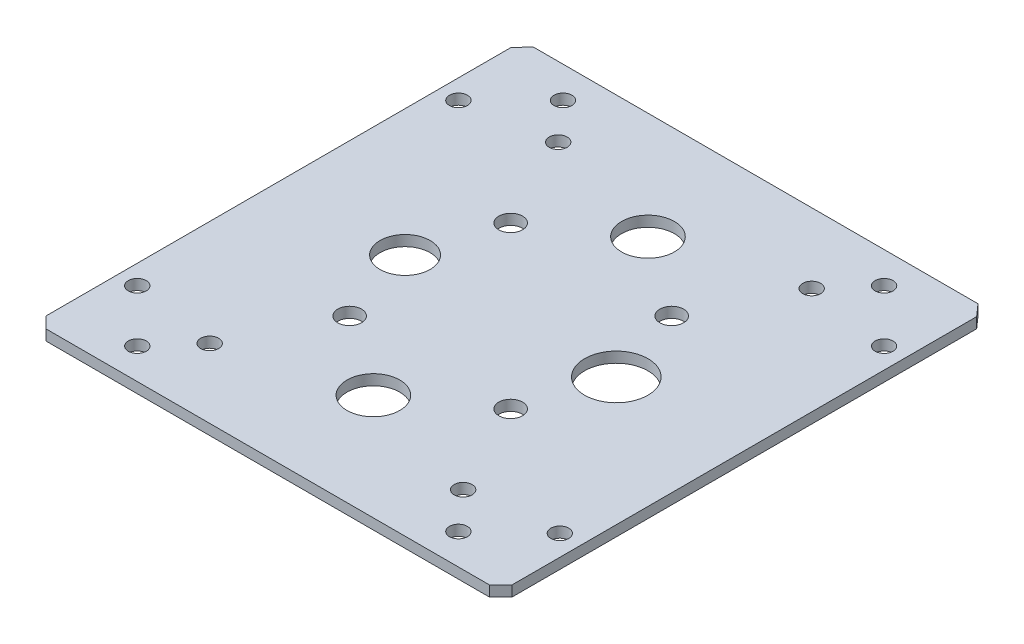
ISO-10303-21;
HEADER;
FILE_DESCRIPTION(('STEP AP214'),'2;1');
FILE_NAME('part.step','',(''),(''),'','','');
FILE_SCHEMA(('AUTOMOTIVE_DESIGN { 1 0 10303 214 1 1 1 1 }'));
ENDSEC;
DATA;
#1=APPLICATION_CONTEXT('core data for automotive mechanical design processes');
#2=APPLICATION_PROTOCOL_DEFINITION('international standard','automotive_design',2000,#1);
#3=PRODUCT_CONTEXT('',#1,'mechanical');
#4=PRODUCT('Part','Part','',(#3));
#5=PRODUCT_RELATED_PRODUCT_CATEGORY('part','',(#4));
#6=PRODUCT_DEFINITION_FORMATION('','',#4);
#7=PRODUCT_DEFINITION_CONTEXT('part definition',#1,'design');
#8=PRODUCT_DEFINITION('design','',#6,#7);
#9=PRODUCT_DEFINITION_SHAPE('','',#8);
#10=(LENGTH_UNIT() NAMED_UNIT(*) SI_UNIT(.MILLI.,.METRE.));
#11=(NAMED_UNIT(*) PLANE_ANGLE_UNIT() SI_UNIT($,.RADIAN.));
#12=(NAMED_UNIT(*) SI_UNIT($,.STERADIAN.) SOLID_ANGLE_UNIT());
#13=UNCERTAINTY_MEASURE_WITH_UNIT(LENGTH_MEASURE(1.E-05),#10,'distance_accuracy_value','');
#14=(GEOMETRIC_REPRESENTATION_CONTEXT(3) GLOBAL_UNCERTAINTY_ASSIGNED_CONTEXT((#13)) GLOBAL_UNIT_ASSIGNED_CONTEXT((#10,
#11,#12)) REPRESENTATION_CONTEXT('',''));
#15=CARTESIAN_POINT('',(0.,0.,0.));
#16=DIRECTION('',(0.,0.,1.));
#17=DIRECTION('',(1.,0.,0.));
#18=AXIS2_PLACEMENT_3D('',#15,#16,#17);
#19=CARTESIAN_POINT('',(0.,2.,0.));
#20=DIRECTION('',(0.,1.,0.));
#21=DIRECTION('',(0.,0.,1.));
#22=AXIS2_PLACEMENT_3D('',#19,#20,#21);
#23=PLANE('',#22);
#24=CARTESIAN_POINT('',(30.40559154,2.,-40.30508646));
#25=DIRECTION('',(0.,1.,0.));
#26=DIRECTION('',(0.,0.,1.));
#27=AXIS2_PLACEMENT_3D('',#24,#25,#26);
#28=CIRCLE('',#27,1.7);
#29=CARTESIAN_POINT('',(30.40559154,2.,-38.60508646));
#30=VERTEX_POINT('',#29);
#31=EDGE_CURVE('E354',#30,#30,#28,.T.);
#32=ORIENTED_EDGE('',*,*,#31,.F.);
#33=EDGE_LOOP('',(#32));
#34=FACE_BOUND('',#33,.T.);
#35=CARTESIAN_POINT('',(40.30508646,2.,31.));
#36=DIRECTION('',(0.,1.,0.));
#37=DIRECTION('',(0.,0.,1.));
#38=AXIS2_PLACEMENT_3D('',#35,#36,#37);
#39=CIRCLE('',#38,1.69491354);
#40=CARTESIAN_POINT('',(40.30508646,2.,32.69491354));
#41=VERTEX_POINT('',#40);
#42=EDGE_CURVE('E338',#41,#41,#39,.T.);
#43=ORIENTED_EDGE('',*,*,#42,.F.);
#44=EDGE_LOOP('',(#43));
#45=FACE_BOUND('',#44,.T.);
#46=CARTESIAN_POINT('',(-40.30508646,2.,-30.40559154));
#47=DIRECTION('',(0.,1.,0.));
#48=DIRECTION('',(0.,0.,1.));
#49=AXIS2_PLACEMENT_3D('',#46,#47,#48);
#50=CIRCLE('',#49,1.7);
#51=CARTESIAN_POINT('',(-40.30508646,2.,-28.70559154));
#52=VERTEX_POINT('',#51);
#53=EDGE_CURVE('E322',#52,#52,#50,.T.);
#54=ORIENTED_EDGE('',*,*,#53,.F.);
#55=EDGE_LOOP('',(#54));
#56=FACE_BOUND('',#55,.T.);
#57=CARTESIAN_POINT('',(-30.40559154,2.,40.30508646));
#58=DIRECTION('',(0.,1.,0.));
#59=DIRECTION('',(0.,0.,1.));
#60=AXIS2_PLACEMENT_3D('',#57,#58,#59);
#61=CIRCLE('',#60,1.7);
#62=CARTESIAN_POINT('',(-30.40559154,2.,42.00508646));
#63=VERTEX_POINT('',#62);
#64=EDGE_CURVE('E306',#63,#63,#61,.T.);
#65=ORIENTED_EDGE('',*,*,#64,.F.);
#66=EDGE_LOOP('',(#65));
#67=FACE_BOUND('',#66,.T.);
#68=CARTESIAN_POINT('',(0.,2.,-26.));
#69=DIRECTION('',(0.,1.,0.));
#70=DIRECTION('',(0.,0.,1.));
#71=AXIS2_PLACEMENT_3D('',#68,#69,#70);
#72=CIRCLE('',#71,5.);
#73=CARTESIAN_POINT('',(0.,2.,-21.));
#74=VERTEX_POINT('',#73);
#75=EDGE_CURVE('E290',#74,#74,#72,.T.);
#76=ORIENTED_EDGE('',*,*,#75,.F.);
#77=EDGE_LOOP('',(#76));
#78=FACE_BOUND('',#77,.T.);
#79=CARTESIAN_POINT('',(20.,2.,0.));
#80=DIRECTION('',(0.,1.,0.));
#81=DIRECTION('',(0.,0.,1.));
#82=AXIS2_PLACEMENT_3D('',#79,#80,#81);
#83=CIRCLE('',#82,6.);
#84=CARTESIAN_POINT('',(20.,2.,6.));
#85=VERTEX_POINT('',#84);
#86=EDGE_CURVE('E274',#85,#85,#83,.T.);
#87=ORIENTED_EDGE('',*,*,#86,.F.);
#88=EDGE_LOOP('',(#87));
#89=FACE_BOUND('',#88,.T.);
#90=CARTESIAN_POINT('',(24.,2.,-33.));
#91=DIRECTION('',(0.,1.,0.));
#92=DIRECTION('',(0.,0.,1.));
#93=AXIS2_PLACEMENT_3D('',#90,#91,#92);
#94=CIRCLE('',#93,1.7);
#95=CARTESIAN_POINT('',(24.,2.,-31.3));
#96=VERTEX_POINT('',#95);
#97=EDGE_CURVE('E258',#96,#96,#94,.T.);
#98=ORIENTED_EDGE('',*,*,#97,.F.);
#99=EDGE_LOOP('',(#98));
#100=FACE_BOUND('',#99,.T.);
#101=CARTESIAN_POINT('',(-24.,2.,33.));
#102=DIRECTION('',(0.,1.,0.));
#103=DIRECTION('',(0.,0.,1.));
#104=AXIS2_PLACEMENT_3D('',#101,#102,#103);
#105=CIRCLE('',#104,1.7);
#106=CARTESIAN_POINT('',(-24.,2.,34.7));
#107=VERTEX_POINT('',#106);
#108=EDGE_CURVE('E242',#107,#107,#105,.T.);
#109=ORIENTED_EDGE('',*,*,#108,.F.);
#110=EDGE_LOOP('',(#109));
#111=FACE_BOUND('',#110,.T.);
#112=CARTESIAN_POINT('',(15.25,2.,15.2500000000002));
#113=DIRECTION('',(0.,1.,0.));
#114=DIRECTION('',(0.,0.,1.));
#115=AXIS2_PLACEMENT_3D('',#112,#113,#114);
#116=CIRCLE('',#115,2.25);
#117=CARTESIAN_POINT('',(15.25,2.,17.5000000000002));
#118=VERTEX_POINT('',#117);
#119=EDGE_CURVE('E226',#118,#118,#116,.T.);
#120=ORIENTED_EDGE('',*,*,#119,.F.);
#121=EDGE_LOOP('',(#120));
#122=FACE_BOUND('',#121,.T.);
#123=CARTESIAN_POINT('',(-15.2499999999998,2.,15.2500000000002));
#124=DIRECTION('',(0.,1.,0.));
#125=DIRECTION('',(0.,0.,1.));
#126=AXIS2_PLACEMENT_3D('',#123,#124,#125);
#127=CIRCLE('',#126,2.25);
#128=CARTESIAN_POINT('',(-15.2499999999998,2.,17.5000000000002));
#129=VERTEX_POINT('',#128);
#130=EDGE_CURVE('E151',#129,#129,#127,.T.);
#131=ORIENTED_EDGE('',*,*,#130,.F.);
#132=EDGE_LOOP('',(#131));
#133=FACE_BOUND('',#132,.T.);
#134=DIRECTION('',(0.707106781186544,0.,0.707106781186551));
#135=VECTOR('',#134,1.);
#136=CARTESIAN_POINT('',(-44.,2.,44.));
#137=LINE('',#136,#135);
#138=CARTESIAN_POINT('',(-44.,2.,44.));
#139=VERTEX_POINT('',#138);
#140=CARTESIAN_POINT('',(-41.8786796564403,2.,46.1213203435597));
#141=VERTEX_POINT('',#140);
#142=EDGE_CURVE('E169',#139,#141,#137,.T.);
#143=ORIENTED_EDGE('',*,*,#142,.T.);
#144=DIRECTION('',(1.,0.,0.));
#145=VECTOR('',#144,1.);
#146=CARTESIAN_POINT('',(-41.8786796564403,2.,46.1213203435597));
#147=LINE('',#146,#145);
#148=CARTESIAN_POINT('',(42.1213203435597,2.,46.1213203435597));
#149=VERTEX_POINT('',#148);
#150=EDGE_CURVE('E105',#141,#149,#147,.T.);
#151=ORIENTED_EDGE('',*,*,#150,.T.);
#152=DIRECTION('',(0.705724441998419,0.,-0.708486423275718));
#153=VECTOR('',#152,1.);
#154=CARTESIAN_POINT('',(42.1213203435597,2.,46.1213203435597));
#155=LINE('',#154,#153);
#156=CARTESIAN_POINT('',(44.2384936695549,2.,43.9958610737325));
#157=VERTEX_POINT('',#156);
#158=EDGE_CURVE('E190',#149,#157,#155,.T.);
#159=ORIENTED_EDGE('',*,*,#158,.T.);
#160=DIRECTION('',(0.,0.,-1.));
#161=VECTOR('',#160,1.);
#162=CARTESIAN_POINT('',(44.2384936695549,2.,43.9958610737325));
#163=LINE('',#162,#161);
#164=CARTESIAN_POINT('',(44.2384936695549,2.,-44.0041389262675));
#165=VERTEX_POINT('',#164);
#166=EDGE_CURVE('E204',#157,#165,#163,.T.);
#167=ORIENTED_EDGE('',*,*,#166,.T.);
#168=DIRECTION('',(-0.662994885720955,0.,-0.748623925284156));
#169=VECTOR('',#168,1.);
#170=CARTESIAN_POINT('',(44.2384936695549,2.,-44.0041389262675));
#171=LINE('',#170,#169);
#172=CARTESIAN_POINT('',(42.2495090123921,2.,-46.25001070212));
#173=VERTEX_POINT('',#172);
#174=EDGE_CURVE('E124',#165,#173,#171,.T.);
#175=ORIENTED_EDGE('',*,*,#174,.T.);
#176=DIRECTION('',(-1.,0.,0.));
#177=VECTOR('',#176,1.);
#178=CARTESIAN_POINT('',(42.2495090123921,2.,-46.25001070212));
#179=LINE('',#178,#177);
#180=CARTESIAN_POINT('',(-42.0156986518309,2.,-46.25001070212));
#181=VERTEX_POINT('',#180);
#182=EDGE_CURVE('E118',#173,#181,#179,.T.);
#183=ORIENTED_EDGE('',*,*,#182,.T.);
#184=DIRECTION('',(-0.661433782723025,0.,0.750003567373323));
#185=VECTOR('',#184,1.);
#186=CARTESIAN_POINT('',(-42.0156986518309,2.,-46.25001070212));
#187=LINE('',#186,#185);
#188=CARTESIAN_POINT('',(-44.,2.,-44.));
#189=VERTEX_POINT('',#188);
#190=EDGE_CURVE('E122',#181,#189,#187,.T.);
#191=ORIENTED_EDGE('',*,*,#190,.T.);
#192=DIRECTION('',(0.,0.,1.));
#193=VECTOR('',#192,1.);
#194=CARTESIAN_POINT('',(-44.,2.,-44.));
#195=LINE('',#194,#193);
#196=EDGE_CURVE('E62',#189,#139,#195,.T.);
#197=ORIENTED_EDGE('',*,*,#196,.T.);
#198=EDGE_LOOP('',(#143,#151,#159,#167,#175,#183,#191,#197));
#199=FACE_BOUND('',#198,.T.);
#200=CARTESIAN_POINT('',(-15.2499999999998,2.,-15.25));
#201=DIRECTION('',(0.,1.,0.));
#202=DIRECTION('',(0.,0.,1.));
#203=AXIS2_PLACEMENT_3D('',#200,#201,#202);
#204=CIRCLE('',#203,2.24999999999985);
#205=CARTESIAN_POINT('',(-15.2499999999998,2.,-13.0000000000002));
#206=VERTEX_POINT('',#205);
#207=EDGE_CURVE('E218',#206,#206,#204,.T.);
#208=ORIENTED_EDGE('',*,*,#207,.F.);
#209=EDGE_LOOP('',(#208));
#210=FACE_BOUND('',#209,.T.);
#211=CARTESIAN_POINT('',(15.25,2.,-15.25));
#212=DIRECTION('',(0.,1.,0.));
#213=DIRECTION('',(0.,0.,1.));
#214=AXIS2_PLACEMENT_3D('',#211,#212,#213);
#215=CIRCLE('',#214,2.25);
#216=CARTESIAN_POINT('',(15.25,2.,-13.));
#217=VERTEX_POINT('',#216);
#218=EDGE_CURVE('E234',#217,#217,#215,.T.);
#219=ORIENTED_EDGE('',*,*,#218,.F.);
#220=EDGE_LOOP('',(#219));
#221=FACE_BOUND('',#220,.T.);
#222=CARTESIAN_POINT('',(24.,2.,33.));
#223=DIRECTION('',(0.,1.,0.));
#224=DIRECTION('',(0.,0.,-1.));
#225=AXIS2_PLACEMENT_3D('',#222,#223,#224);
#226=CIRCLE('',#225,1.7);
#227=CARTESIAN_POINT('',(24.,2.,31.3));
#228=VERTEX_POINT('',#227);
#229=EDGE_CURVE('E250',#228,#228,#226,.T.);
#230=ORIENTED_EDGE('',*,*,#229,.F.);
#231=EDGE_LOOP('',(#230));
#232=FACE_BOUND('',#231,.T.);
#233=CARTESIAN_POINT('',(-24.,2.,-33.));
#234=DIRECTION('',(0.,1.,0.));
#235=DIRECTION('',(0.,0.,-1.));
#236=AXIS2_PLACEMENT_3D('',#233,#234,#235);
#237=CIRCLE('',#236,1.7);
#238=CARTESIAN_POINT('',(-24.,2.,-34.7));
#239=VERTEX_POINT('',#238);
#240=EDGE_CURVE('E266',#239,#239,#237,.T.);
#241=ORIENTED_EDGE('',*,*,#240,.F.);
#242=EDGE_LOOP('',(#241));
#243=FACE_BOUND('',#242,.T.);
#244=CARTESIAN_POINT('',(-20.,2.,0.));
#245=DIRECTION('',(0.,1.,0.));
#246=DIRECTION('',(0.,0.,1.));
#247=AXIS2_PLACEMENT_3D('',#244,#245,#246);
#248=CIRCLE('',#247,4.75000000000016);
#249=CARTESIAN_POINT('',(-20.,2.,4.75000000000016));
#250=VERTEX_POINT('',#249);
#251=EDGE_CURVE('E282',#250,#250,#248,.T.);
#252=ORIENTED_EDGE('',*,*,#251,.F.);
#253=EDGE_LOOP('',(#252));
#254=FACE_BOUND('',#253,.T.);
#255=CARTESIAN_POINT('',(0.,2.,26.));
#256=DIRECTION('',(0.,1.,0.));
#257=DIRECTION('',(0.,0.,1.));
#258=AXIS2_PLACEMENT_3D('',#255,#256,#257);
#259=CIRCLE('',#258,5.);
#260=CARTESIAN_POINT('',(0.,2.,31.));
#261=VERTEX_POINT('',#260);
#262=EDGE_CURVE('E298',#261,#261,#259,.T.);
#263=ORIENTED_EDGE('',*,*,#262,.F.);
#264=EDGE_LOOP('',(#263));
#265=FACE_BOUND('',#264,.T.);
#266=CARTESIAN_POINT('',(-30.40559154,2.,-40.30508646));
#267=DIRECTION('',(0.,1.,0.));
#268=DIRECTION('',(0.,0.,1.));
#269=AXIS2_PLACEMENT_3D('',#266,#267,#268);
#270=CIRCLE('',#269,1.7);
#271=CARTESIAN_POINT('',(-30.40559154,2.,-38.60508646));
#272=VERTEX_POINT('',#271);
#273=EDGE_CURVE('E314',#272,#272,#270,.T.);
#274=ORIENTED_EDGE('',*,*,#273,.F.);
#275=EDGE_LOOP('',(#274));
#276=FACE_BOUND('',#275,.T.);
#277=CARTESIAN_POINT('',(30.40559154,2.,40.30508646));
#278=DIRECTION('',(0.,1.,0.));
#279=DIRECTION('',(0.,0.,1.));
#280=AXIS2_PLACEMENT_3D('',#277,#278,#279);
#281=CIRCLE('',#280,1.7);
#282=CARTESIAN_POINT('',(30.40559154,2.,42.00508646));
#283=VERTEX_POINT('',#282);
#284=EDGE_CURVE('E330',#283,#283,#281,.T.);
#285=ORIENTED_EDGE('',*,*,#284,.F.);
#286=EDGE_LOOP('',(#285));
#287=FACE_BOUND('',#286,.T.);
#288=CARTESIAN_POINT('',(40.30508646,2.,-30.40559154));
#289=DIRECTION('',(0.,1.,0.));
#290=DIRECTION('',(0.,0.,1.));
#291=AXIS2_PLACEMENT_3D('',#288,#289,#290);
#292=CIRCLE('',#291,1.69491353999988);
#293=CARTESIAN_POINT('',(40.30508646,2.,-28.7106780000001));
#294=VERTEX_POINT('',#293);
#295=EDGE_CURVE('E346',#294,#294,#292,.T.);
#296=ORIENTED_EDGE('',*,*,#295,.F.);
#297=EDGE_LOOP('',(#296));
#298=FACE_BOUND('',#297,.T.);
#299=CARTESIAN_POINT('',(-40.30508646,2.,30.40559154));
#300=DIRECTION('',(0.,1.,0.));
#301=DIRECTION('',(0.,0.,-1.));
#302=AXIS2_PLACEMENT_3D('',#299,#300,#301);
#303=CIRCLE('',#302,1.7);
#304=CARTESIAN_POINT('',(-40.30508646,2.,28.70559154));
#305=VERTEX_POINT('',#304);
#306=EDGE_CURVE('E362',#305,#305,#303,.T.);
#307=ORIENTED_EDGE('',*,*,#306,.F.);
#308=EDGE_LOOP('',(#307));
#309=FACE_BOUND('',#308,.T.);
#310=ADVANCED_FACE('F44',(#34,#45,#56,#67,#78,#89,#100,#111,#122,#133,#199,#210,#221,#232,#243,
#254,#265,#276,#287,#298,#309),#23,.T.);
#311=CARTESIAN_POINT('',(0.,0.,0.));
#312=DIRECTION('',(0.,1.,0.));
#313=DIRECTION('',(0.,0.,1.));
#314=AXIS2_PLACEMENT_3D('',#311,#312,#313);
#315=PLANE('',#314);
#316=DIRECTION('',(0.707106781186544,0.,0.707106781186551));
#317=VECTOR('',#316,1.);
#318=CARTESIAN_POINT('',(-44.,0.,44.));
#319=LINE('',#318,#317);
#320=CARTESIAN_POINT('',(-44.,0.,44.));
#321=VERTEX_POINT('',#320);
#322=CARTESIAN_POINT('',(-41.8786796564403,0.,46.1213203435597));
#323=VERTEX_POINT('',#322);
#324=EDGE_CURVE('E146',#321,#323,#319,.T.);
#325=ORIENTED_EDGE('',*,*,#324,.F.);
#326=DIRECTION('',(0.,0.,1.));
#327=VECTOR('',#326,1.);
#328=CARTESIAN_POINT('',(-44.,0.,-44.));
#329=LINE('',#328,#327);
#330=CARTESIAN_POINT('',(-44.,0.,-44.));
#331=VERTEX_POINT('',#330);
#332=EDGE_CURVE('E97',#331,#321,#329,.T.);
#333=ORIENTED_EDGE('',*,*,#332,.F.);
#334=DIRECTION('',(-0.661433782723025,0.,0.750003567373323));
#335=VECTOR('',#334,1.);
#336=CARTESIAN_POINT('',(-42.0156986518309,0.,-46.25001070212));
#337=LINE('',#336,#335);
#338=CARTESIAN_POINT('',(-42.0156986518309,0.,-46.25001070212));
#339=VERTEX_POINT('',#338);
#340=EDGE_CURVE('E91',#339,#331,#337,.T.);
#341=ORIENTED_EDGE('',*,*,#340,.F.);
#342=DIRECTION('',(-1.,0.,0.));
#343=VECTOR('',#342,1.);
#344=CARTESIAN_POINT('',(42.2495090123921,0.,-46.25001070212));
#345=LINE('',#344,#343);
#346=CARTESIAN_POINT('',(42.2495090123921,0.,-46.25001070212));
#347=VERTEX_POINT('',#346);
#348=EDGE_CURVE('E133',#347,#339,#345,.T.);
#349=ORIENTED_EDGE('',*,*,#348,.F.);
#350=DIRECTION('',(-0.662994885720955,0.,-0.748623925284156));
#351=VECTOR('',#350,1.);
#352=CARTESIAN_POINT('',(44.2384936695549,0.,-44.0041389262675));
#353=LINE('',#352,#351);
#354=CARTESIAN_POINT('',(44.2384936695549,0.,-44.0041389262675));
#355=VERTEX_POINT('',#354);
#356=EDGE_CURVE('E160',#355,#347,#353,.T.);
#357=ORIENTED_EDGE('',*,*,#356,.F.);
#358=DIRECTION('',(0.,0.,-1.));
#359=VECTOR('',#358,1.);
#360=CARTESIAN_POINT('',(44.2384936695549,0.,43.9958610737325));
#361=LINE('',#360,#359);
#362=CARTESIAN_POINT('',(44.2384936695549,0.,43.9958610737325));
#363=VERTEX_POINT('',#362);
#364=EDGE_CURVE('E157',#363,#355,#361,.T.);
#365=ORIENTED_EDGE('',*,*,#364,.F.);
#366=DIRECTION('',(0.705724441998419,0.,-0.708486423275718));
#367=VECTOR('',#366,1.);
#368=CARTESIAN_POINT('',(42.1213203435597,0.,46.1213203435597));
#369=LINE('',#368,#367);
#370=CARTESIAN_POINT('',(42.1213203435597,0.,46.1213203435597));
#371=VERTEX_POINT('',#370);
#372=EDGE_CURVE('E154',#371,#363,#369,.T.);
#373=ORIENTED_EDGE('',*,*,#372,.F.);
#374=DIRECTION('',(1.,0.,0.));
#375=VECTOR('',#374,1.);
#376=CARTESIAN_POINT('',(-41.8786796564403,0.,46.1213203435597));
#377=LINE('',#376,#375);
#378=EDGE_CURVE('E150',#323,#371,#377,.T.);
#379=ORIENTED_EDGE('',*,*,#378,.F.);
#380=EDGE_LOOP('',(#325,#333,#341,#349,#357,#365,#373,#379));
#381=FACE_BOUND('',#380,.T.);
#382=CARTESIAN_POINT('',(-15.2499999999998,0.,15.2500000000002));
#383=DIRECTION('',(0.,1.,0.));
#384=DIRECTION('',(0.,0.,1.));
#385=AXIS2_PLACEMENT_3D('',#382,#383,#384);
#386=CIRCLE('',#385,2.25);
#387=CARTESIAN_POINT('',(-15.2499999999998,0.,17.5000000000002));
#388=VERTEX_POINT('',#387);
#389=EDGE_CURVE('E214',#388,#388,#386,.T.);
#390=ORIENTED_EDGE('',*,*,#389,.T.);
#391=EDGE_LOOP('',(#390));
#392=FACE_BOUND('',#391,.T.);
#393=CARTESIAN_POINT('',(-15.2499999999998,0.,-15.25));
#394=DIRECTION('',(0.,1.,0.));
#395=DIRECTION('',(0.,0.,1.));
#396=AXIS2_PLACEMENT_3D('',#393,#394,#395);
#397=CIRCLE('',#396,2.24999999999985);
#398=CARTESIAN_POINT('',(-15.2499999999998,0.,-13.0000000000002));
#399=VERTEX_POINT('',#398);
#400=EDGE_CURVE('E222',#399,#399,#397,.T.);
#401=ORIENTED_EDGE('',*,*,#400,.T.);
#402=EDGE_LOOP('',(#401));
#403=FACE_BOUND('',#402,.T.);
#404=CARTESIAN_POINT('',(15.25,0.,15.2500000000002));
#405=DIRECTION('',(0.,1.,0.));
#406=DIRECTION('',(0.,0.,1.));
#407=AXIS2_PLACEMENT_3D('',#404,#405,#406);
#408=CIRCLE('',#407,2.25);
#409=CARTESIAN_POINT('',(15.25,0.,17.5000000000002));
#410=VERTEX_POINT('',#409);
#411=EDGE_CURVE('E230',#410,#410,#408,.T.);
#412=ORIENTED_EDGE('',*,*,#411,.T.);
#413=EDGE_LOOP('',(#412));
#414=FACE_BOUND('',#413,.T.);
#415=CARTESIAN_POINT('',(15.25,0.,-15.25));
#416=DIRECTION('',(0.,1.,0.));
#417=DIRECTION('',(0.,0.,1.));
#418=AXIS2_PLACEMENT_3D('',#415,#416,#417);
#419=CIRCLE('',#418,2.25);
#420=CARTESIAN_POINT('',(15.25,0.,-13.));
#421=VERTEX_POINT('',#420);
#422=EDGE_CURVE('E238',#421,#421,#419,.T.);
#423=ORIENTED_EDGE('',*,*,#422,.T.);
#424=EDGE_LOOP('',(#423));
#425=FACE_BOUND('',#424,.T.);
#426=CARTESIAN_POINT('',(-24.,0.,33.));
#427=DIRECTION('',(0.,1.,0.));
#428=DIRECTION('',(0.,0.,1.));
#429=AXIS2_PLACEMENT_3D('',#426,#427,#428);
#430=CIRCLE('',#429,1.7);
#431=CARTESIAN_POINT('',(-24.,0.,34.7));
#432=VERTEX_POINT('',#431);
#433=EDGE_CURVE('E246',#432,#432,#430,.T.);
#434=ORIENTED_EDGE('',*,*,#433,.T.);
#435=EDGE_LOOP('',(#434));
#436=FACE_BOUND('',#435,.T.);
#437=CARTESIAN_POINT('',(24.,0.,33.));
#438=DIRECTION('',(0.,1.,0.));
#439=DIRECTION('',(0.,0.,-1.));
#440=AXIS2_PLACEMENT_3D('',#437,#438,#439);
#441=CIRCLE('',#440,1.7);
#442=CARTESIAN_POINT('',(24.,0.,31.3));
#443=VERTEX_POINT('',#442);
#444=EDGE_CURVE('E254',#443,#443,#441,.T.);
#445=ORIENTED_EDGE('',*,*,#444,.T.);
#446=EDGE_LOOP('',(#445));
#447=FACE_BOUND('',#446,.T.);
#448=CARTESIAN_POINT('',(24.,0.,-33.));
#449=DIRECTION('',(0.,1.,0.));
#450=DIRECTION('',(0.,0.,1.));
#451=AXIS2_PLACEMENT_3D('',#448,#449,#450);
#452=CIRCLE('',#451,1.7);
#453=CARTESIAN_POINT('',(24.,0.,-31.3));
#454=VERTEX_POINT('',#453);
#455=EDGE_CURVE('E262',#454,#454,#452,.T.);
#456=ORIENTED_EDGE('',*,*,#455,.T.);
#457=EDGE_LOOP('',(#456));
#458=FACE_BOUND('',#457,.T.);
#459=CARTESIAN_POINT('',(-24.,0.,-33.));
#460=DIRECTION('',(0.,1.,0.));
#461=DIRECTION('',(0.,0.,-1.));
#462=AXIS2_PLACEMENT_3D('',#459,#460,#461);
#463=CIRCLE('',#462,1.7);
#464=CARTESIAN_POINT('',(-24.,0.,-34.7));
#465=VERTEX_POINT('',#464);
#466=EDGE_CURVE('E270',#465,#465,#463,.T.);
#467=ORIENTED_EDGE('',*,*,#466,.T.);
#468=EDGE_LOOP('',(#467));
#469=FACE_BOUND('',#468,.T.);
#470=CARTESIAN_POINT('',(20.,0.,0.));
#471=DIRECTION('',(0.,1.,0.));
#472=DIRECTION('',(0.,0.,1.));
#473=AXIS2_PLACEMENT_3D('',#470,#471,#472);
#474=CIRCLE('',#473,6.);
#475=CARTESIAN_POINT('',(20.,0.,6.));
#476=VERTEX_POINT('',#475);
#477=EDGE_CURVE('E278',#476,#476,#474,.T.);
#478=ORIENTED_EDGE('',*,*,#477,.T.);
#479=EDGE_LOOP('',(#478));
#480=FACE_BOUND('',#479,.T.);
#481=CARTESIAN_POINT('',(-20.,0.,0.));
#482=DIRECTION('',(0.,1.,0.));
#483=DIRECTION('',(0.,0.,1.));
#484=AXIS2_PLACEMENT_3D('',#481,#482,#483);
#485=CIRCLE('',#484,4.75000000000016);
#486=CARTESIAN_POINT('',(-20.,0.,4.75000000000016));
#487=VERTEX_POINT('',#486);
#488=EDGE_CURVE('E286',#487,#487,#485,.T.);
#489=ORIENTED_EDGE('',*,*,#488,.T.);
#490=EDGE_LOOP('',(#489));
#491=FACE_BOUND('',#490,.T.);
#492=CARTESIAN_POINT('',(0.,0.,-26.));
#493=DIRECTION('',(0.,1.,0.));
#494=DIRECTION('',(0.,0.,1.));
#495=AXIS2_PLACEMENT_3D('',#492,#493,#494);
#496=CIRCLE('',#495,5.);
#497=CARTESIAN_POINT('',(0.,0.,-21.));
#498=VERTEX_POINT('',#497);
#499=EDGE_CURVE('E294',#498,#498,#496,.T.);
#500=ORIENTED_EDGE('',*,*,#499,.T.);
#501=EDGE_LOOP('',(#500));
#502=FACE_BOUND('',#501,.T.);
#503=CARTESIAN_POINT('',(0.,0.,26.));
#504=DIRECTION('',(0.,1.,0.));
#505=DIRECTION('',(0.,0.,1.));
#506=AXIS2_PLACEMENT_3D('',#503,#504,#505);
#507=CIRCLE('',#506,5.);
#508=CARTESIAN_POINT('',(0.,0.,31.));
#509=VERTEX_POINT('',#508);
#510=EDGE_CURVE('E302',#509,#509,#507,.T.);
#511=ORIENTED_EDGE('',*,*,#510,.T.);
#512=EDGE_LOOP('',(#511));
#513=FACE_BOUND('',#512,.T.);
#514=CARTESIAN_POINT('',(-30.40559154,0.,40.30508646));
#515=DIRECTION('',(0.,1.,0.));
#516=DIRECTION('',(0.,0.,1.));
#517=AXIS2_PLACEMENT_3D('',#514,#515,#516);
#518=CIRCLE('',#517,1.7);
#519=CARTESIAN_POINT('',(-30.40559154,0.,42.00508646));
#520=VERTEX_POINT('',#519);
#521=EDGE_CURVE('E310',#520,#520,#518,.T.);
#522=ORIENTED_EDGE('',*,*,#521,.T.);
#523=EDGE_LOOP('',(#522));
#524=FACE_BOUND('',#523,.T.);
#525=CARTESIAN_POINT('',(-30.40559154,0.,-40.30508646));
#526=DIRECTION('',(0.,1.,0.));
#527=DIRECTION('',(0.,0.,1.));
#528=AXIS2_PLACEMENT_3D('',#525,#526,#527);
#529=CIRCLE('',#528,1.7);
#530=CARTESIAN_POINT('',(-30.40559154,0.,-38.60508646));
#531=VERTEX_POINT('',#530);
#532=EDGE_CURVE('E318',#531,#531,#529,.T.);
#533=ORIENTED_EDGE('',*,*,#532,.T.);
#534=EDGE_LOOP('',(#533));
#535=FACE_BOUND('',#534,.T.);
#536=CARTESIAN_POINT('',(-40.30508646,0.,-30.40559154));
#537=DIRECTION('',(0.,1.,0.));
#538=DIRECTION('',(0.,0.,1.));
#539=AXIS2_PLACEMENT_3D('',#536,#537,#538);
#540=CIRCLE('',#539,1.7);
#541=CARTESIAN_POINT('',(-40.30508646,0.,-28.70559154));
#542=VERTEX_POINT('',#541);
#543=EDGE_CURVE('E326',#542,#542,#540,.T.);
#544=ORIENTED_EDGE('',*,*,#543,.T.);
#545=EDGE_LOOP('',(#544));
#546=FACE_BOUND('',#545,.T.);
#547=CARTESIAN_POINT('',(30.40559154,0.,40.30508646));
#548=DIRECTION('',(0.,1.,0.));
#549=DIRECTION('',(0.,0.,1.));
#550=AXIS2_PLACEMENT_3D('',#547,#548,#549);
#551=CIRCLE('',#550,1.7);
#552=CARTESIAN_POINT('',(30.40559154,0.,42.00508646));
#553=VERTEX_POINT('',#552);
#554=EDGE_CURVE('E334',#553,#553,#551,.T.);
#555=ORIENTED_EDGE('',*,*,#554,.T.);
#556=EDGE_LOOP('',(#555));
#557=FACE_BOUND('',#556,.T.);
#558=CARTESIAN_POINT('',(40.30508646,0.,31.));
#559=DIRECTION('',(0.,1.,0.));
#560=DIRECTION('',(0.,0.,1.));
#561=AXIS2_PLACEMENT_3D('',#558,#559,#560);
#562=CIRCLE('',#561,1.69491354);
#563=CARTESIAN_POINT('',(40.30508646,0.,32.69491354));
#564=VERTEX_POINT('',#563);
#565=EDGE_CURVE('E342',#564,#564,#562,.T.);
#566=ORIENTED_EDGE('',*,*,#565,.T.);
#567=EDGE_LOOP('',(#566));
#568=FACE_BOUND('',#567,.T.);
#569=CARTESIAN_POINT('',(40.30508646,0.,-30.40559154));
#570=DIRECTION('',(0.,1.,0.));
#571=DIRECTION('',(0.,0.,1.));
#572=AXIS2_PLACEMENT_3D('',#569,#570,#571);
#573=CIRCLE('',#572,1.69491353999988);
#574=CARTESIAN_POINT('',(40.30508646,0.,-28.7106780000001));
#575=VERTEX_POINT('',#574);
#576=EDGE_CURVE('E350',#575,#575,#573,.T.);
#577=ORIENTED_EDGE('',*,*,#576,.T.);
#578=EDGE_LOOP('',(#577));
#579=FACE_BOUND('',#578,.T.);
#580=CARTESIAN_POINT('',(30.40559154,0.,-40.30508646));
#581=DIRECTION('',(0.,1.,0.));
#582=DIRECTION('',(0.,0.,1.));
#583=AXIS2_PLACEMENT_3D('',#580,#581,#582);
#584=CIRCLE('',#583,1.7);
#585=CARTESIAN_POINT('',(30.40559154,0.,-38.60508646));
#586=VERTEX_POINT('',#585);
#587=EDGE_CURVE('E358',#586,#586,#584,.T.);
#588=ORIENTED_EDGE('',*,*,#587,.T.);
#589=EDGE_LOOP('',(#588));
#590=FACE_BOUND('',#589,.T.);
#591=CARTESIAN_POINT('',(-40.30508646,0.,30.40559154));
#592=DIRECTION('',(0.,1.,0.));
#593=DIRECTION('',(0.,0.,-1.));
#594=AXIS2_PLACEMENT_3D('',#591,#592,#593);
#595=CIRCLE('',#594,1.7);
#596=CARTESIAN_POINT('',(-40.30508646,0.,28.70559154));
#597=VERTEX_POINT('',#596);
#598=EDGE_CURVE('E366',#597,#597,#595,.T.);
#599=ORIENTED_EDGE('',*,*,#598,.T.);
#600=EDGE_LOOP('',(#599));
#601=FACE_BOUND('',#600,.T.);
#602=ADVANCED_FACE('F194',(#381,#392,#403,#414,#425,#436,#447,#458,#469,#480,#491,#502,#513,
#524,#535,#546,#557,#568,#579,#590,#601),#315,.F.);
#603=CARTESIAN_POINT('',(-44.,2.,44.));
#604=DIRECTION('',(0.707106781186551,0.,-0.707106781186544));
#605=DIRECTION('',(-0.707106781186544,0.,-0.707106781186551));
#606=AXIS2_PLACEMENT_3D('',#603,#604,#605);
#607=PLANE('',#606);
#608=ORIENTED_EDGE('',*,*,#324,.T.);
#609=DIRECTION('',(0.,-1.,0.));
#610=VECTOR('',#609,1.);
#611=CARTESIAN_POINT('',(-41.8786796564403,2.,46.1213203435597));
#612=LINE('',#611,#610);
#613=EDGE_CURVE('E11',#141,#323,#612,.T.);
#614=ORIENTED_EDGE('',*,*,#613,.F.);
#615=ORIENTED_EDGE('',*,*,#142,.F.);
#616=DIRECTION('',(0.,-1.,0.));
#617=VECTOR('',#616,1.);
#618=CARTESIAN_POINT('',(-44.,2.,44.));
#619=LINE('',#618,#617);
#620=EDGE_CURVE('E142',#139,#321,#619,.T.);
#621=ORIENTED_EDGE('',*,*,#620,.T.);
#622=EDGE_LOOP('',(#608,#614,#615,#621));
#623=FACE_BOUND('',#622,.T.);
#624=ADVANCED_FACE('F46',(#623),#607,.F.);
#625=CARTESIAN_POINT('',(-41.8786796564403,2.,46.1213203435597));
#626=DIRECTION('',(0.,0.,-1.));
#627=DIRECTION('',(-1.,0.,0.));
#628=AXIS2_PLACEMENT_3D('',#625,#626,#627);
#629=PLANE('',#628);
#630=ORIENTED_EDGE('',*,*,#378,.T.);
#631=DIRECTION('',(0.,-1.,0.));
#632=VECTOR('',#631,1.);
#633=CARTESIAN_POINT('',(42.1213203435597,2.,46.1213203435597));
#634=LINE('',#633,#632);
#635=EDGE_CURVE('E54',#149,#371,#634,.T.);
#636=ORIENTED_EDGE('',*,*,#635,.F.);
#637=ORIENTED_EDGE('',*,*,#150,.F.);
#638=ORIENTED_EDGE('',*,*,#613,.T.);
#639=EDGE_LOOP('',(#630,#636,#637,#638));
#640=FACE_BOUND('',#639,.T.);
#641=ADVANCED_FACE('F402',(#640),#629,.F.);
#642=CARTESIAN_POINT('',(42.1213203435597,2.,46.1213203435597));
#643=DIRECTION('',(-0.708486423275718,0.,-0.705724441998419));
#644=DIRECTION('',(-0.705724441998419,0.,0.708486423275718));
#645=AXIS2_PLACEMENT_3D('',#642,#643,#644);
#646=PLANE('',#645);
#647=ORIENTED_EDGE('',*,*,#372,.T.);
#648=DIRECTION('',(0.,-1.,0.));
#649=VECTOR('',#648,1.);
#650=CARTESIAN_POINT('',(44.2384936695549,2.,43.9958610737325));
#651=LINE('',#650,#649);
#652=EDGE_CURVE('E180',#157,#363,#651,.T.);
#653=ORIENTED_EDGE('',*,*,#652,.F.);
#654=ORIENTED_EDGE('',*,*,#158,.F.);
#655=ORIENTED_EDGE('',*,*,#635,.T.);
#656=EDGE_LOOP('',(#647,#653,#654,#655));
#657=FACE_BOUND('',#656,.T.);
#658=ADVANCED_FACE('F188',(#657),#646,.F.);
#659=CARTESIAN_POINT('',(44.2384936695549,2.,43.9958610737325));
#660=DIRECTION('',(-1.,0.,0.));
#661=DIRECTION('',(0.,0.,1.));
#662=AXIS2_PLACEMENT_3D('',#659,#660,#661);
#663=PLANE('',#662);
#664=ORIENTED_EDGE('',*,*,#364,.T.);
#665=DIRECTION('',(0.,-1.,0.));
#666=VECTOR('',#665,1.);
#667=CARTESIAN_POINT('',(44.2384936695549,2.,-44.0041389262675));
#668=LINE('',#667,#666);
#669=EDGE_CURVE('E176',#165,#355,#668,.T.);
#670=ORIENTED_EDGE('',*,*,#669,.F.);
#671=ORIENTED_EDGE('',*,*,#166,.F.);
#672=ORIENTED_EDGE('',*,*,#652,.T.);
#673=EDGE_LOOP('',(#664,#670,#671,#672));
#674=FACE_BOUND('',#673,.T.);
#675=ADVANCED_FACE('F199',(#674),#663,.F.);
#676=CARTESIAN_POINT('',(44.2384936695549,2.,-44.0041389262675));
#677=DIRECTION('',(-0.748623925284156,0.,0.662994885720955));
#678=DIRECTION('',(0.662994885720955,0.,0.748623925284156));
#679=AXIS2_PLACEMENT_3D('',#676,#677,#678);
#680=PLANE('',#679);
#681=ORIENTED_EDGE('',*,*,#356,.T.);
#682=DIRECTION('',(0.,-1.,0.));
#683=VECTOR('',#682,1.);
#684=CARTESIAN_POINT('',(42.2495090123921,2.,-46.25001070212));
#685=LINE('',#684,#683);
#686=EDGE_CURVE('E135',#173,#347,#685,.T.);
#687=ORIENTED_EDGE('',*,*,#686,.F.);
#688=ORIENTED_EDGE('',*,*,#174,.F.);
#689=ORIENTED_EDGE('',*,*,#669,.T.);
#690=EDGE_LOOP('',(#681,#687,#688,#689));
#691=FACE_BOUND('',#690,.T.);
#692=ADVANCED_FACE('F202',(#691),#680,.F.);
#693=CARTESIAN_POINT('',(42.2495090123921,2.,-46.25001070212));
#694=DIRECTION('',(0.,0.,1.));
#695=DIRECTION('',(1.,0.,0.));
#696=AXIS2_PLACEMENT_3D('',#693,#694,#695);
#697=PLANE('',#696);
#698=ORIENTED_EDGE('',*,*,#348,.T.);
#699=DIRECTION('',(0.,-1.,0.));
#700=VECTOR('',#699,1.);
#701=CARTESIAN_POINT('',(-42.0156986518309,2.,-46.25001070212));
#702=LINE('',#701,#700);
#703=EDGE_CURVE('E130',#181,#339,#702,.T.);
#704=ORIENTED_EDGE('',*,*,#703,.F.);
#705=ORIENTED_EDGE('',*,*,#182,.F.);
#706=ORIENTED_EDGE('',*,*,#686,.T.);
#707=EDGE_LOOP('',(#698,#704,#705,#706));
#708=FACE_BOUND('',#707,.T.);
#709=ADVANCED_FACE('F131',(#708),#697,.F.);
#710=CARTESIAN_POINT('',(-42.0156986518309,2.,-46.25001070212));
#711=DIRECTION('',(0.750003567373323,0.,0.661433782723025));
#712=DIRECTION('',(0.661433782723025,0.,-0.750003567373323));
#713=AXIS2_PLACEMENT_3D('',#710,#711,#712);
#714=PLANE('',#713);
#715=ORIENTED_EDGE('',*,*,#340,.T.);
#716=DIRECTION('',(0.,-1.,0.));
#717=VECTOR('',#716,1.);
#718=CARTESIAN_POINT('',(-44.,2.,-44.));
#719=LINE('',#718,#717);
#720=EDGE_CURVE('E136',#189,#331,#719,.T.);
#721=ORIENTED_EDGE('',*,*,#720,.F.);
#722=ORIENTED_EDGE('',*,*,#190,.F.);
#723=ORIENTED_EDGE('',*,*,#703,.T.);
#724=EDGE_LOOP('',(#715,#721,#722,#723));
#725=FACE_BOUND('',#724,.T.);
#726=ADVANCED_FACE('F138',(#725),#714,.F.);
#727=CARTESIAN_POINT('',(-44.,2.,-44.));
#728=DIRECTION('',(1.,0.,0.));
#729=DIRECTION('',(0.,0.,-1.));
#730=AXIS2_PLACEMENT_3D('',#727,#728,#729);
#731=PLANE('',#730);
#732=ORIENTED_EDGE('',*,*,#332,.T.);
#733=ORIENTED_EDGE('',*,*,#620,.F.);
#734=ORIENTED_EDGE('',*,*,#196,.F.);
#735=ORIENTED_EDGE('',*,*,#720,.T.);
#736=EDGE_LOOP('',(#732,#733,#734,#735));
#737=FACE_BOUND('',#736,.T.);
#738=ADVANCED_FACE('F390',(#737),#731,.F.);
#739=CARTESIAN_POINT('',(-15.2499999999998,2.,15.2500000000002));
#740=DIRECTION('',(0.,-1.,0.));
#741=DIRECTION('',(0.,0.,-1.));
#742=AXIS2_PLACEMENT_3D('',#739,#740,#741);
#743=CYLINDRICAL_SURFACE('',#742,2.25);
#744=ORIENTED_EDGE('',*,*,#130,.T.);
#745=EDGE_LOOP('',(#744));
#746=FACE_BOUND('',#745,.T.);
#747=ORIENTED_EDGE('',*,*,#389,.F.);
#748=EDGE_LOOP('',(#747));
#749=FACE_BOUND('',#748,.T.);
#750=ADVANCED_FACE('F387',(#746,#749),#743,.F.);
#751=CARTESIAN_POINT('',(-15.2499999999998,2.,-15.25));
#752=DIRECTION('',(0.,-1.,0.));
#753=DIRECTION('',(0.,0.,-1.));
#754=AXIS2_PLACEMENT_3D('',#751,#752,#753);
#755=CYLINDRICAL_SURFACE('',#754,2.24999999999985);
#756=ORIENTED_EDGE('',*,*,#207,.T.);
#757=EDGE_LOOP('',(#756));
#758=FACE_BOUND('',#757,.T.);
#759=ORIENTED_EDGE('',*,*,#400,.F.);
#760=EDGE_LOOP('',(#759));
#761=FACE_BOUND('',#760,.T.);
#762=ADVANCED_FACE('F465',(#758,#761),#755,.F.);
#763=CARTESIAN_POINT('',(15.25,2.,15.2500000000002));
#764=DIRECTION('',(0.,-1.,0.));
#765=DIRECTION('',(0.,0.,-1.));
#766=AXIS2_PLACEMENT_3D('',#763,#764,#765);
#767=CYLINDRICAL_SURFACE('',#766,2.25);
#768=ORIENTED_EDGE('',*,*,#119,.T.);
#769=EDGE_LOOP('',(#768));
#770=FACE_BOUND('',#769,.T.);
#771=ORIENTED_EDGE('',*,*,#411,.F.);
#772=EDGE_LOOP('',(#771));
#773=FACE_BOUND('',#772,.T.);
#774=ADVANCED_FACE('F473',(#770,#773),#767,.F.);
#775=CARTESIAN_POINT('',(15.25,2.,-15.25));
#776=DIRECTION('',(0.,-1.,0.));
#777=DIRECTION('',(0.,0.,-1.));
#778=AXIS2_PLACEMENT_3D('',#775,#776,#777);
#779=CYLINDRICAL_SURFACE('',#778,2.25);
#780=ORIENTED_EDGE('',*,*,#218,.T.);
#781=EDGE_LOOP('',(#780));
#782=FACE_BOUND('',#781,.T.);
#783=ORIENTED_EDGE('',*,*,#422,.F.);
#784=EDGE_LOOP('',(#783));
#785=FACE_BOUND('',#784,.T.);
#786=ADVANCED_FACE('F481',(#782,#785),#779,.F.);
#787=CARTESIAN_POINT('',(-24.,2.,33.));
#788=DIRECTION('',(0.,-1.,0.));
#789=DIRECTION('',(0.,0.,-1.));
#790=AXIS2_PLACEMENT_3D('',#787,#788,#789);
#791=CYLINDRICAL_SURFACE('',#790,1.7);
#792=ORIENTED_EDGE('',*,*,#108,.T.);
#793=EDGE_LOOP('',(#792));
#794=FACE_BOUND('',#793,.T.);
#795=ORIENTED_EDGE('',*,*,#433,.F.);
#796=EDGE_LOOP('',(#795));
#797=FACE_BOUND('',#796,.T.);
#798=ADVANCED_FACE('F490',(#794,#797),#791,.F.);
#799=CARTESIAN_POINT('',(24.,2.,33.));
#800=DIRECTION('',(0.,-1.,0.));
#801=DIRECTION('',(0.,0.,-1.));
#802=AXIS2_PLACEMENT_3D('',#799,#800,#801);
#803=CYLINDRICAL_SURFACE('',#802,1.7);
#804=ORIENTED_EDGE('',*,*,#229,.T.);
#805=EDGE_LOOP('',(#804));
#806=FACE_BOUND('',#805,.T.);
#807=ORIENTED_EDGE('',*,*,#444,.F.);
#808=EDGE_LOOP('',(#807));
#809=FACE_BOUND('',#808,.T.);
#810=ADVANCED_FACE('F499',(#806,#809),#803,.F.);
#811=CARTESIAN_POINT('',(24.,2.,-33.));
#812=DIRECTION('',(0.,-1.,0.));
#813=DIRECTION('',(0.,0.,-1.));
#814=AXIS2_PLACEMENT_3D('',#811,#812,#813);
#815=CYLINDRICAL_SURFACE('',#814,1.7);
#816=ORIENTED_EDGE('',*,*,#97,.T.);
#817=EDGE_LOOP('',(#816));
#818=FACE_BOUND('',#817,.T.);
#819=ORIENTED_EDGE('',*,*,#455,.F.);
#820=EDGE_LOOP('',(#819));
#821=FACE_BOUND('',#820,.T.);
#822=ADVANCED_FACE('F508',(#818,#821),#815,.F.);
#823=CARTESIAN_POINT('',(-24.,2.,-33.));
#824=DIRECTION('',(0.,-1.,0.));
#825=DIRECTION('',(0.,0.,-1.));
#826=AXIS2_PLACEMENT_3D('',#823,#824,#825);
#827=CYLINDRICAL_SURFACE('',#826,1.7);
#828=ORIENTED_EDGE('',*,*,#240,.T.);
#829=EDGE_LOOP('',(#828));
#830=FACE_BOUND('',#829,.T.);
#831=ORIENTED_EDGE('',*,*,#466,.F.);
#832=EDGE_LOOP('',(#831));
#833=FACE_BOUND('',#832,.T.);
#834=ADVANCED_FACE('F517',(#830,#833),#827,.F.);
#835=CARTESIAN_POINT('',(20.,2.,0.));
#836=DIRECTION('',(0.,-1.,0.));
#837=DIRECTION('',(0.,0.,-1.));
#838=AXIS2_PLACEMENT_3D('',#835,#836,#837);
#839=CYLINDRICAL_SURFACE('',#838,6.);
#840=ORIENTED_EDGE('',*,*,#86,.T.);
#841=EDGE_LOOP('',(#840));
#842=FACE_BOUND('',#841,.T.);
#843=ORIENTED_EDGE('',*,*,#477,.F.);
#844=EDGE_LOOP('',(#843));
#845=FACE_BOUND('',#844,.T.);
#846=ADVANCED_FACE('F526',(#842,#845),#839,.F.);
#847=CARTESIAN_POINT('',(-20.,2.,0.));
#848=DIRECTION('',(0.,-1.,0.));
#849=DIRECTION('',(0.,0.,-1.));
#850=AXIS2_PLACEMENT_3D('',#847,#848,#849);
#851=CYLINDRICAL_SURFACE('',#850,4.75000000000016);
#852=ORIENTED_EDGE('',*,*,#251,.T.);
#853=EDGE_LOOP('',(#852));
#854=FACE_BOUND('',#853,.T.);
#855=ORIENTED_EDGE('',*,*,#488,.F.);
#856=EDGE_LOOP('',(#855));
#857=FACE_BOUND('',#856,.T.);
#858=ADVANCED_FACE('F535',(#854,#857),#851,.F.);
#859=CARTESIAN_POINT('',(0.,2.,-26.));
#860=DIRECTION('',(0.,-1.,0.));
#861=DIRECTION('',(0.,0.,-1.));
#862=AXIS2_PLACEMENT_3D('',#859,#860,#861);
#863=CYLINDRICAL_SURFACE('',#862,5.);
#864=ORIENTED_EDGE('',*,*,#75,.T.);
#865=EDGE_LOOP('',(#864));
#866=FACE_BOUND('',#865,.T.);
#867=ORIENTED_EDGE('',*,*,#499,.F.);
#868=EDGE_LOOP('',(#867));
#869=FACE_BOUND('',#868,.T.);
#870=ADVANCED_FACE('F544',(#866,#869),#863,.F.);
#871=CARTESIAN_POINT('',(0.,2.,26.));
#872=DIRECTION('',(0.,-1.,0.));
#873=DIRECTION('',(0.,0.,-1.));
#874=AXIS2_PLACEMENT_3D('',#871,#872,#873);
#875=CYLINDRICAL_SURFACE('',#874,5.);
#876=ORIENTED_EDGE('',*,*,#262,.T.);
#877=EDGE_LOOP('',(#876));
#878=FACE_BOUND('',#877,.T.);
#879=ORIENTED_EDGE('',*,*,#510,.F.);
#880=EDGE_LOOP('',(#879));
#881=FACE_BOUND('',#880,.T.);
#882=ADVANCED_FACE('F553',(#878,#881),#875,.F.);
#883=CARTESIAN_POINT('',(-30.40559154,2.,40.30508646));
#884=DIRECTION('',(0.,-1.,0.));
#885=DIRECTION('',(0.,0.,-1.));
#886=AXIS2_PLACEMENT_3D('',#883,#884,#885);
#887=CYLINDRICAL_SURFACE('',#886,1.7);
#888=ORIENTED_EDGE('',*,*,#64,.T.);
#889=EDGE_LOOP('',(#888));
#890=FACE_BOUND('',#889,.T.);
#891=ORIENTED_EDGE('',*,*,#521,.F.);
#892=EDGE_LOOP('',(#891));
#893=FACE_BOUND('',#892,.T.);
#894=ADVANCED_FACE('F562',(#890,#893),#887,.F.);
#895=CARTESIAN_POINT('',(-30.40559154,2.,-40.30508646));
#896=DIRECTION('',(0.,-1.,0.));
#897=DIRECTION('',(0.,0.,-1.));
#898=AXIS2_PLACEMENT_3D('',#895,#896,#897);
#899=CYLINDRICAL_SURFACE('',#898,1.7);
#900=ORIENTED_EDGE('',*,*,#273,.T.);
#901=EDGE_LOOP('',(#900));
#902=FACE_BOUND('',#901,.T.);
#903=ORIENTED_EDGE('',*,*,#532,.F.);
#904=EDGE_LOOP('',(#903));
#905=FACE_BOUND('',#904,.T.);
#906=ADVANCED_FACE('F571',(#902,#905),#899,.F.);
#907=CARTESIAN_POINT('',(-40.30508646,2.,-30.40559154));
#908=DIRECTION('',(0.,-1.,0.));
#909=DIRECTION('',(0.,0.,-1.));
#910=AXIS2_PLACEMENT_3D('',#907,#908,#909);
#911=CYLINDRICAL_SURFACE('',#910,1.7);
#912=ORIENTED_EDGE('',*,*,#53,.T.);
#913=EDGE_LOOP('',(#912));
#914=FACE_BOUND('',#913,.T.);
#915=ORIENTED_EDGE('',*,*,#543,.F.);
#916=EDGE_LOOP('',(#915));
#917=FACE_BOUND('',#916,.T.);
#918=ADVANCED_FACE('F580',(#914,#917),#911,.F.);
#919=CARTESIAN_POINT('',(30.40559154,2.,40.30508646));
#920=DIRECTION('',(0.,-1.,0.));
#921=DIRECTION('',(0.,0.,-1.));
#922=AXIS2_PLACEMENT_3D('',#919,#920,#921);
#923=CYLINDRICAL_SURFACE('',#922,1.7);
#924=ORIENTED_EDGE('',*,*,#284,.T.);
#925=EDGE_LOOP('',(#924));
#926=FACE_BOUND('',#925,.T.);
#927=ORIENTED_EDGE('',*,*,#554,.F.);
#928=EDGE_LOOP('',(#927));
#929=FACE_BOUND('',#928,.T.);
#930=ADVANCED_FACE('F589',(#926,#929),#923,.F.);
#931=CARTESIAN_POINT('',(40.30508646,2.,31.));
#932=DIRECTION('',(0.,-1.,0.));
#933=DIRECTION('',(0.,0.,-1.));
#934=AXIS2_PLACEMENT_3D('',#931,#932,#933);
#935=CYLINDRICAL_SURFACE('',#934,1.69491354);
#936=ORIENTED_EDGE('',*,*,#42,.T.);
#937=EDGE_LOOP('',(#936));
#938=FACE_BOUND('',#937,.T.);
#939=ORIENTED_EDGE('',*,*,#565,.F.);
#940=EDGE_LOOP('',(#939));
#941=FACE_BOUND('',#940,.T.);
#942=ADVANCED_FACE('F598',(#938,#941),#935,.F.);
#943=CARTESIAN_POINT('',(40.30508646,2.,-30.40559154));
#944=DIRECTION('',(0.,-1.,0.));
#945=DIRECTION('',(0.,0.,-1.));
#946=AXIS2_PLACEMENT_3D('',#943,#944,#945);
#947=CYLINDRICAL_SURFACE('',#946,1.69491353999988);
#948=ORIENTED_EDGE('',*,*,#295,.T.);
#949=EDGE_LOOP('',(#948));
#950=FACE_BOUND('',#949,.T.);
#951=ORIENTED_EDGE('',*,*,#576,.F.);
#952=EDGE_LOOP('',(#951));
#953=FACE_BOUND('',#952,.T.);
#954=ADVANCED_FACE('F607',(#950,#953),#947,.F.);
#955=CARTESIAN_POINT('',(30.40559154,2.,-40.30508646));
#956=DIRECTION('',(0.,-1.,0.));
#957=DIRECTION('',(0.,0.,-1.));
#958=AXIS2_PLACEMENT_3D('',#955,#956,#957);
#959=CYLINDRICAL_SURFACE('',#958,1.7);
#960=ORIENTED_EDGE('',*,*,#31,.T.);
#961=EDGE_LOOP('',(#960));
#962=FACE_BOUND('',#961,.T.);
#963=ORIENTED_EDGE('',*,*,#587,.F.);
#964=EDGE_LOOP('',(#963));
#965=FACE_BOUND('',#964,.T.);
#966=ADVANCED_FACE('F616',(#962,#965),#959,.F.);
#967=CARTESIAN_POINT('',(-40.30508646,2.,30.40559154));
#968=DIRECTION('',(0.,-1.,0.));
#969=DIRECTION('',(0.,0.,-1.));
#970=AXIS2_PLACEMENT_3D('',#967,#968,#969);
#971=CYLINDRICAL_SURFACE('',#970,1.7);
#972=ORIENTED_EDGE('',*,*,#306,.T.);
#973=EDGE_LOOP('',(#972));
#974=FACE_BOUND('',#973,.T.);
#975=ORIENTED_EDGE('',*,*,#598,.F.);
#976=EDGE_LOOP('',(#975));
#977=FACE_BOUND('',#976,.T.);
#978=ADVANCED_FACE('F374',(#974,#977),#971,.F.);
#979=CLOSED_SHELL('',(#310,#602,#624,#641,#658,#675,#692,#709,#726,#738,#750,#762,#774,#786,
#798,#810,#822,#834,#846,#858,#870,#882,#894,#906,#918,#930,#942,#954,#966,#978));
#980=MANIFOLD_SOLID_BREP('B2',#979);
#981=ADVANCED_BREP_SHAPE_REPRESENTATION('',(#18,#980),#14);
#982=SHAPE_DEFINITION_REPRESENTATION(#9,#981);
ENDSEC;
END-ISO-10303-21;
